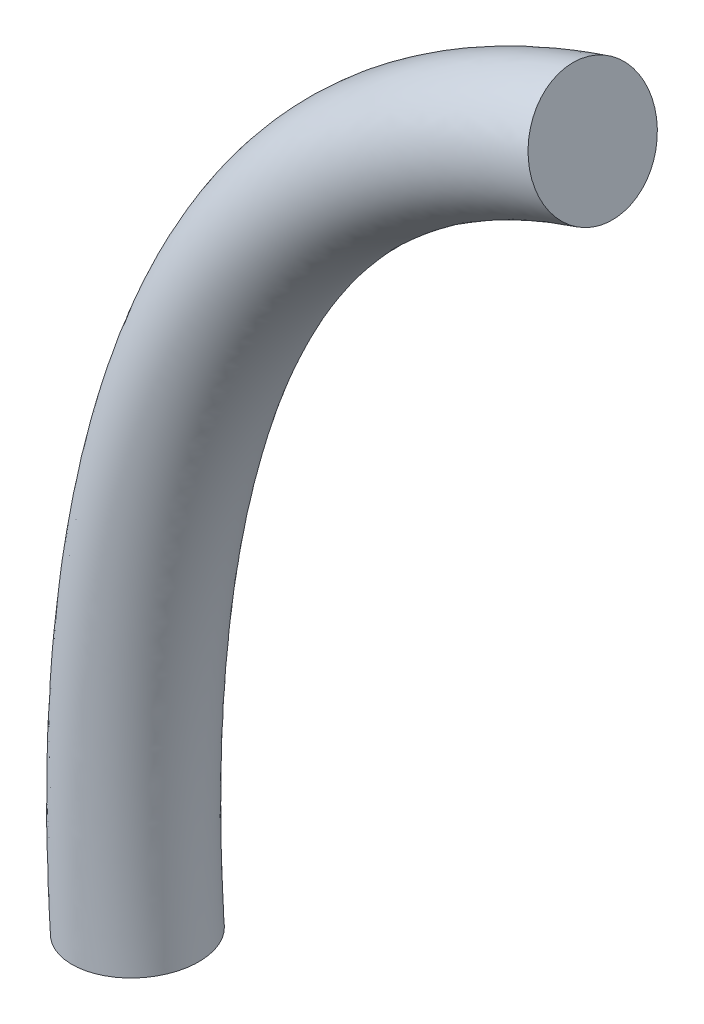
ISO-10303-21;
HEADER;
FILE_DESCRIPTION(('STEP AP214'),'2;1');
FILE_NAME('part.step','',(''),(''),'','','');
FILE_SCHEMA(('AUTOMOTIVE_DESIGN { 1 0 10303 214 1 1 1 1 }'));
ENDSEC;
DATA;
#1=APPLICATION_CONTEXT('core data for automotive mechanical design processes');
#2=APPLICATION_PROTOCOL_DEFINITION('international standard','automotive_design',2000,#1);
#3=PRODUCT_CONTEXT('',#1,'mechanical');
#4=PRODUCT('Part','Part','',(#3));
#5=PRODUCT_RELATED_PRODUCT_CATEGORY('part','',(#4));
#6=PRODUCT_DEFINITION_FORMATION('','',#4);
#7=PRODUCT_DEFINITION_CONTEXT('part definition',#1,'design');
#8=PRODUCT_DEFINITION('design','',#6,#7);
#9=PRODUCT_DEFINITION_SHAPE('','',#8);
#10=(LENGTH_UNIT() NAMED_UNIT(*) SI_UNIT(.MILLI.,.METRE.));
#11=(NAMED_UNIT(*) PLANE_ANGLE_UNIT() SI_UNIT($,.RADIAN.));
#12=(NAMED_UNIT(*) SI_UNIT($,.STERADIAN.) SOLID_ANGLE_UNIT());
#13=UNCERTAINTY_MEASURE_WITH_UNIT(LENGTH_MEASURE(1.E-05),#10,'distance_accuracy_value','');
#14=(GEOMETRIC_REPRESENTATION_CONTEXT(3) GLOBAL_UNCERTAINTY_ASSIGNED_CONTEXT((#13)) GLOBAL_UNIT_ASSIGNED_CONTEXT((#10,
#11,#12)) REPRESENTATION_CONTEXT('',''));
#15=CARTESIAN_POINT('',(0.,0.,0.));
#16=DIRECTION('',(0.,0.,1.));
#17=DIRECTION('',(1.,0.,0.));
#18=AXIS2_PLACEMENT_3D('',#15,#16,#17);
#19=CARTESIAN_POINT('',(0.,0.,0.));
#20=DIRECTION('',(-0.0657196567119963,0.99783812651234,0.));
#21=DIRECTION('',(-0.99783812651234,-0.0657196567119963,0.));
#22=AXIS2_PLACEMENT_3D('',#19,#20,#21);
#23=PLANE('',#22);
#24=CARTESIAN_POINT('',(0.,0.,0.));
#25=DIRECTION('',(-0.0657196567119963,0.99783812651234,0.));
#26=DIRECTION('',(-0.99783812651234,-0.0657196567119963,0.));
#27=AXIS2_PLACEMENT_3D('',#24,#25,#26);
#28=CIRCLE('',#27,3.175);
#29=CARTESIAN_POINT('',(-3.16813605167668,-0.208659910060588,0.));
#30=VERTEX_POINT('',#29);
#31=EDGE_CURVE('E48',#30,#30,#28,.T.);
#32=ORIENTED_EDGE('',*,*,#31,.F.);
#33=EDGE_LOOP('',(#32));
#34=FACE_BOUND('',#33,.T.);
#35=ADVANCED_FACE('F41',(#34),#23,.F.);
#36=CARTESIAN_POINT('',(23.4695197465737,46.99,0.));
#37=DIRECTION('',(0.947669183755504,0.319254002575029,0.));
#38=DIRECTION('',(-0.319254002575029,0.947669183755504,0.));
#39=AXIS2_PLACEMENT_3D('',#36,#37,#38);
#40=PLANE('',#39);
#41=CARTESIAN_POINT('',(23.4695197465737,46.99,0.));
#42=DIRECTION('',(0.947669183755504,0.319254002575029,0.));
#43=DIRECTION('',(-0.319254002575029,0.947669183755504,0.));
#44=AXIS2_PLACEMENT_3D('',#41,#42,#43);
#45=CIRCLE('',#44,3.175);
#46=CARTESIAN_POINT('',(22.4558882883979,49.9988496584237,0.));
#47=VERTEX_POINT('',#46);
#48=EDGE_CURVE('E12',#47,#47,#45,.T.);
#49=ORIENTED_EDGE('',*,*,#48,.T.);
#50=EDGE_LOOP('',(#49));
#51=FACE_BOUND('',#50,.T.);
#52=ADVANCED_FACE('F55',(#51),#40,.T.);
#53=CARTESIAN_POINT('',(-3.16813605167668,-0.208659910060588,0.));
#54=CARTESIAN_POINT('',(-3.78791775225984,9.20164198062213,0.));
#55=CARTESIAN_POINT('',(-3.06763938592938,19.6427024611285,0.));
#56=CARTESIAN_POINT('',(2.49713220760735,33.526772902046,0.));
#57=CARTESIAN_POINT('',(5.11771012580131,37.8596186417009,0.));
#58=CARTESIAN_POINT('',(12.3064506370747,45.1669018012811,0.));
#59=CARTESIAN_POINT('',(16.8748752160636,48.1186990815427,0.));
#60=CARTESIAN_POINT('',(22.4558882883979,49.9988496584237,0.));
#61=CARTESIAN_POINT('',(-3.16813605167668,-0.208659910060588,6.35));
#62=CARTESIAN_POINT('',(-3.78791775225984,9.20164198062213,6.35));
#63=CARTESIAN_POINT('',(-3.06763938592938,19.6427024611285,6.35));
#64=CARTESIAN_POINT('',(2.49713220760735,33.526772902046,6.35));
#65=CARTESIAN_POINT('',(5.11771012580131,37.8596186417009,6.35));
#66=CARTESIAN_POINT('',(12.3064506370747,45.1669018012811,6.35));
#67=CARTESIAN_POINT('',(16.8748752160636,48.1186990815427,6.35));
#68=CARTESIAN_POINT('',(22.4558882883979,49.9988496584237,6.35));
#69=CARTESIAN_POINT('',(3.16813605167668,0.208659910060588,6.35));
#70=CARTESIAN_POINT('',(2.59091559091285,8.97274376155641,6.35));
#71=CARTESIAN_POINT('',(3.34329233749134,18.5695506885925,6.35));
#72=CARTESIAN_POINT('',(8.13295779401031,30.519736150127,6.35));
#73=CARTESIAN_POINT('',(10.3214346208667,34.0945515128125,6.35));
#74=CARTESIAN_POINT('',(16.1561164759959,40.0254475295058,6.35));
#75=CARTESIAN_POINT('',(19.8020595162838,42.4041683265075,6.35));
#76=CARTESIAN_POINT('',(24.4831512047494,43.9811503415763,6.35));
#77=CARTESIAN_POINT('',(3.16813605167668,0.208659910060588,0.));
#78=CARTESIAN_POINT('',(2.59091559091285,8.97274376155641,0.));
#79=CARTESIAN_POINT('',(3.34329233749134,18.5695506885925,0.));
#80=CARTESIAN_POINT('',(8.13295779401031,30.519736150127,0.));
#81=CARTESIAN_POINT('',(10.3214346208667,34.0945515128125,0.));
#82=CARTESIAN_POINT('',(16.1561164759959,40.0254475295058,0.));
#83=CARTESIAN_POINT('',(19.8020595162697,42.4041683264793,0.));
#84=CARTESIAN_POINT('',(24.4831512047494,43.9811503415763,0.));
#85=CARTESIAN_POINT('',(3.16813605167668,0.208659910060588,-6.35));
#86=CARTESIAN_POINT('',(2.59091559091286,8.97274376155641,-6.35));
#87=CARTESIAN_POINT('',(3.34329233749134,18.5695506885925,-6.35));
#88=CARTESIAN_POINT('',(8.13295779401031,30.519736150127,-6.35));
#89=CARTESIAN_POINT('',(10.3214346208667,34.0945515128125,-6.35));
#90=CARTESIAN_POINT('',(16.1561164759959,40.0254475295058,-6.35));
#91=CARTESIAN_POINT('',(19.8020595162556,42.4041683264511,-6.35));
#92=CARTESIAN_POINT('',(24.4831512047494,43.9811503415763,-6.35));
#93=CARTESIAN_POINT('',(-3.16813605167668,-0.208659910060588,-6.35));
#94=CARTESIAN_POINT('',(-3.78791775225984,9.20164198062213,-6.35));
#95=CARTESIAN_POINT('',(-3.06763938592938,19.6427024611285,-6.35));
#96=CARTESIAN_POINT('',(2.49713220760735,33.526772902046,-6.35));
#97=CARTESIAN_POINT('',(5.11771012580131,37.8596186417009,-6.35));
#98=CARTESIAN_POINT('',(12.3064506370747,45.1669018012811,-6.35));
#99=CARTESIAN_POINT('',(16.8748752160636,48.1186990815427,-6.35));
#100=CARTESIAN_POINT('',(22.4558882883979,49.9988496584237,-6.35));
#101=CARTESIAN_POINT('',(-3.16813605167668,-0.208659910060588,0.));
#102=CARTESIAN_POINT('',(-3.78791775225984,9.20164198062213,0.));
#103=CARTESIAN_POINT('',(-3.06763938592938,19.6427024611285,0.));
#104=CARTESIAN_POINT('',(2.49713220760735,33.526772902046,0.));
#105=CARTESIAN_POINT('',(5.11771012580131,37.8596186417009,0.));
#106=CARTESIAN_POINT('',(12.3064506370747,45.1669018012811,0.));
#107=CARTESIAN_POINT('',(16.8748752160636,48.1186990815427,0.));
#108=CARTESIAN_POINT('',(22.4558882883979,49.9988496584237,0.));
#109=(BOUNDED_SURFACE() B_SPLINE_SURFACE(3,3,((#53,#54,#55,#56,#57,#58,#59,#60),(#61,#62,#63,
#64,#65,#66,#67,#68),(#69,#70,#71,#72,#73,#74,#75,#76),(#77,#78,#79,#80,#81,#82,#83,#84),(#85,
#86,#87,#88,#89,#90,#91,#92),(#93,#94,#95,#96,#97,#98,#99,#100),(#101,#102,#103,#104,#105,#106,
#107,#108)),.UNSPECIFIED.,.T.,.F.,.F.) B_SPLINE_SURFACE_WITH_KNOTS((4,3,4),(4,2,2,4),(0.,0.5,
1.),(0.,0.5,0.75,1.),
.UNSPECIFIED.) GEOMETRIC_REPRESENTATION_ITEM() RATIONAL_B_SPLINE_SURFACE(((1.,1.,1.,1.,1.,1.,1.,
1.),(0.333333333333333,0.333333333333333,0.333333333333333,0.333333333333333,0.333333333333333,
0.333333333333333,0.333333333333333,0.333333333333333),(0.333333333333333,0.333333333333333,
0.333333333333333,0.333333333333333,0.333333333333333,0.333333333333333,0.333333333333333,
0.333333333333333),(1.,1.,1.,1.,1.,1.,1.,1.),(0.333333333333333,0.333333333333333,
0.333333333333333,0.333333333333333,0.333333333333333,0.333333333333333,0.333333333333333,
0.333333333333333),(0.333333333333333,0.333333333333333,0.333333333333333,0.333333333333333,
0.333333333333333,0.333333333333333,0.333333333333333,0.333333333333333),(1.,1.,1.,1.,1.,1.,1.,1.))) REPRESENTATION_ITEM('') SURFACE());
#110=ORIENTED_EDGE('',*,*,#48,.F.);
#111=EDGE_LOOP('',(#110));
#112=FACE_BOUND('',#111,.T.);
#113=ORIENTED_EDGE('',*,*,#31,.T.);
#114=EDGE_LOOP('',(#113));
#115=FACE_BOUND('',#114,.T.);
#116=ADVANCED_FACE('F57',(#112,#115),#109,.T.);
#117=CLOSED_SHELL('',(#35,#52,#116));
#118=MANIFOLD_SOLID_BREP('B2',#117);
#119=ADVANCED_BREP_SHAPE_REPRESENTATION('',(#18,#118),#14);
#120=SHAPE_DEFINITION_REPRESENTATION(#9,#119);
ENDSEC;
END-ISO-10303-21;
